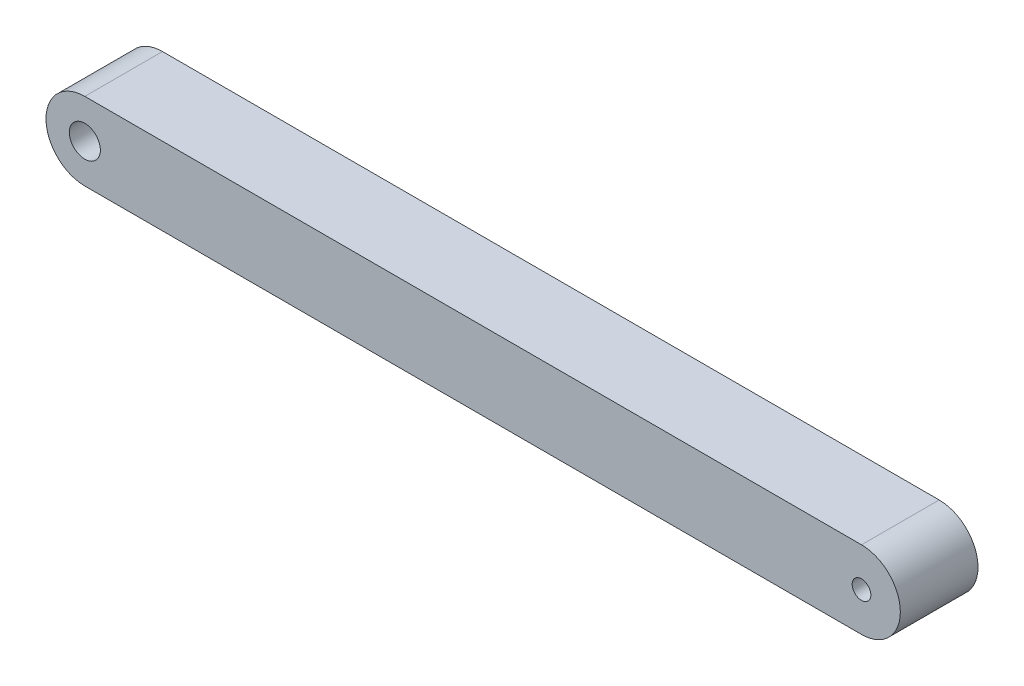
ISO-10303-21;
HEADER;
FILE_DESCRIPTION(('STEP AP214'),'2;1');
FILE_NAME('part.step','',(''),(''),'','','');
FILE_SCHEMA(('AUTOMOTIVE_DESIGN { 1 0 10303 214 1 1 1 1 }'));
ENDSEC;
DATA;
#1=APPLICATION_CONTEXT('core data for automotive mechanical design processes');
#2=APPLICATION_PROTOCOL_DEFINITION('international standard','automotive_design',2000,#1);
#3=PRODUCT_CONTEXT('',#1,'mechanical');
#4=PRODUCT('Part','Part','',(#3));
#5=PRODUCT_RELATED_PRODUCT_CATEGORY('part','',(#4));
#6=PRODUCT_DEFINITION_FORMATION('','',#4);
#7=PRODUCT_DEFINITION_CONTEXT('part definition',#1,'design');
#8=PRODUCT_DEFINITION('design','',#6,#7);
#9=PRODUCT_DEFINITION_SHAPE('','',#8);
#10=(LENGTH_UNIT() NAMED_UNIT(*) SI_UNIT(.MILLI.,.METRE.));
#11=(NAMED_UNIT(*) PLANE_ANGLE_UNIT() SI_UNIT($,.RADIAN.));
#12=(NAMED_UNIT(*) SI_UNIT($,.STERADIAN.) SOLID_ANGLE_UNIT());
#13=UNCERTAINTY_MEASURE_WITH_UNIT(LENGTH_MEASURE(1.E-05),#10,'distance_accuracy_value','');
#14=(GEOMETRIC_REPRESENTATION_CONTEXT(3) GLOBAL_UNCERTAINTY_ASSIGNED_CONTEXT((#13)) GLOBAL_UNIT_ASSIGNED_CONTEXT((#10,
#11,#12)) REPRESENTATION_CONTEXT('',''));
#15=CARTESIAN_POINT('',(0.,0.,0.));
#16=DIRECTION('',(0.,0.,1.));
#17=DIRECTION('',(1.,0.,0.));
#18=AXIS2_PLACEMENT_3D('',#15,#16,#17);
#19=CARTESIAN_POINT('',(-77.3942171788576,0.,10.));
#20=DIRECTION('',(0.,0.,-1.));
#21=DIRECTION('',(-1.,0.,0.));
#22=AXIS2_PLACEMENT_3D('',#19,#20,#21);
#23=CYLINDRICAL_SURFACE('',#22,5.);
#24=CARTESIAN_POINT('',(-77.3942171788576,0.,0.));
#25=DIRECTION('',(0.,0.,1.));
#26=DIRECTION('',(1.,0.,0.));
#27=AXIS2_PLACEMENT_3D('',#24,#25,#26);
#28=CIRCLE('',#27,5.);
#29=CARTESIAN_POINT('',(-77.3942171788576,5.,0.));
#30=VERTEX_POINT('',#29);
#31=CARTESIAN_POINT('',(-77.3942171788576,-5.,0.));
#32=VERTEX_POINT('',#31);
#33=EDGE_CURVE('E107',#30,#32,#28,.T.);
#34=ORIENTED_EDGE('',*,*,#33,.T.);
#35=DIRECTION('',(0.,0.,-1.));
#36=VECTOR('',#35,1.);
#37=CARTESIAN_POINT('',(-77.3942171788576,-5.,10.));
#38=LINE('',#37,#36);
#39=CARTESIAN_POINT('',(-77.3942171788576,-5.,10.));
#40=VERTEX_POINT('',#39);
#41=EDGE_CURVE('E11',#40,#32,#38,.T.);
#42=ORIENTED_EDGE('',*,*,#41,.F.);
#43=CARTESIAN_POINT('',(-77.3942171788576,0.,10.));
#44=DIRECTION('',(0.,0.,1.));
#45=DIRECTION('',(1.,0.,0.));
#46=AXIS2_PLACEMENT_3D('',#43,#44,#45);
#47=CIRCLE('',#46,5.);
#48=CARTESIAN_POINT('',(-77.3942171788576,5.,10.));
#49=VERTEX_POINT('',#48);
#50=EDGE_CURVE('E91',#49,#40,#47,.T.);
#51=ORIENTED_EDGE('',*,*,#50,.F.);
#52=DIRECTION('',(0.,0.,-1.));
#53=VECTOR('',#52,1.);
#54=CARTESIAN_POINT('',(-77.3942171788576,5.,10.));
#55=LINE('',#54,#53);
#56=EDGE_CURVE('E103',#49,#30,#55,.T.);
#57=ORIENTED_EDGE('',*,*,#56,.T.);
#58=EDGE_LOOP('',(#34,#42,#51,#57));
#59=FACE_BOUND('',#58,.T.);
#60=ADVANCED_FACE('F39',(#59),#23,.T.);
#61=CARTESIAN_POINT('',(-77.3942171788576,-5.,10.));
#62=DIRECTION('',(0.,1.,0.));
#63=DIRECTION('',(0.,0.,1.));
#64=AXIS2_PLACEMENT_3D('',#61,#62,#63);
#65=PLANE('',#64);
#66=DIRECTION('',(1.,0.,0.));
#67=VECTOR('',#66,1.);
#68=CARTESIAN_POINT('',(-77.3942171788576,-5.,0.));
#69=LINE('',#68,#67);
#70=CARTESIAN_POINT('',(22.6057828211424,-5.,0.));
#71=VERTEX_POINT('',#70);
#72=EDGE_CURVE('E96',#32,#71,#69,.T.);
#73=ORIENTED_EDGE('',*,*,#72,.T.);
#74=DIRECTION('',(0.,0.,-1.));
#75=VECTOR('',#74,1.);
#76=CARTESIAN_POINT('',(22.6057828211424,-5.,10.));
#77=LINE('',#76,#75);
#78=CARTESIAN_POINT('',(22.6057828211424,-5.,10.));
#79=VERTEX_POINT('',#78);
#80=EDGE_CURVE('E48',#79,#71,#77,.T.);
#81=ORIENTED_EDGE('',*,*,#80,.F.);
#82=DIRECTION('',(1.,0.,0.));
#83=VECTOR('',#82,1.);
#84=CARTESIAN_POINT('',(-77.3942171788576,-5.,10.));
#85=LINE('',#84,#83);
#86=EDGE_CURVE('E86',#40,#79,#85,.T.);
#87=ORIENTED_EDGE('',*,*,#86,.F.);
#88=ORIENTED_EDGE('',*,*,#41,.T.);
#89=EDGE_LOOP('',(#73,#81,#87,#88));
#90=FACE_BOUND('',#89,.T.);
#91=ADVANCED_FACE('F95',(#90),#65,.F.);
#92=CARTESIAN_POINT('',(22.6057828211424,0.,10.));
#93=DIRECTION('',(0.,0.,-1.));
#94=DIRECTION('',(-1.,0.,0.));
#95=AXIS2_PLACEMENT_3D('',#92,#93,#94);
#96=CYLINDRICAL_SURFACE('',#95,5.);
#97=CARTESIAN_POINT('',(22.6057828211424,0.,0.));
#98=DIRECTION('',(0.,0.,1.));
#99=DIRECTION('',(1.,0.,0.));
#100=AXIS2_PLACEMENT_3D('',#97,#98,#99);
#101=CIRCLE('',#100,5.);
#102=CARTESIAN_POINT('',(22.6057828211424,5.,0.));
#103=VERTEX_POINT('',#102);
#104=EDGE_CURVE('E73',#71,#103,#101,.T.);
#105=ORIENTED_EDGE('',*,*,#104,.T.);
#106=DIRECTION('',(0.,0.,-1.));
#107=VECTOR('',#106,1.);
#108=CARTESIAN_POINT('',(22.6057828211424,5.,10.));
#109=LINE('',#108,#107);
#110=CARTESIAN_POINT('',(22.6057828211424,5.,10.));
#111=VERTEX_POINT('',#110);
#112=EDGE_CURVE('E98',#111,#103,#109,.T.);
#113=ORIENTED_EDGE('',*,*,#112,.F.);
#114=CARTESIAN_POINT('',(22.6057828211424,0.,10.));
#115=DIRECTION('',(0.,0.,1.));
#116=DIRECTION('',(1.,0.,0.));
#117=AXIS2_PLACEMENT_3D('',#114,#115,#116);
#118=CIRCLE('',#117,5.);
#119=EDGE_CURVE('E89',#79,#111,#118,.T.);
#120=ORIENTED_EDGE('',*,*,#119,.F.);
#121=ORIENTED_EDGE('',*,*,#80,.T.);
#122=EDGE_LOOP('',(#105,#113,#120,#121));
#123=FACE_BOUND('',#122,.T.);
#124=ADVANCED_FACE('F99',(#123),#96,.T.);
#125=CARTESIAN_POINT('',(-77.3942171788576,5.,10.));
#126=DIRECTION('',(0.,-1.,0.));
#127=DIRECTION('',(0.,0.,-1.));
#128=AXIS2_PLACEMENT_3D('',#125,#126,#127);
#129=PLANE('',#128);
#130=DIRECTION('',(-1.,0.,0.));
#131=VECTOR('',#130,1.);
#132=CARTESIAN_POINT('',(-77.3942171788576,5.,0.));
#133=LINE('',#132,#131);
#134=EDGE_CURVE('E79',#103,#30,#133,.T.);
#135=ORIENTED_EDGE('',*,*,#134,.T.);
#136=ORIENTED_EDGE('',*,*,#56,.F.);
#137=DIRECTION('',(-1.,0.,0.));
#138=VECTOR('',#137,1.);
#139=CARTESIAN_POINT('',(-77.3942171788576,5.,10.));
#140=LINE('',#139,#138);
#141=EDGE_CURVE('E56',#111,#49,#140,.T.);
#142=ORIENTED_EDGE('',*,*,#141,.F.);
#143=ORIENTED_EDGE('',*,*,#112,.T.);
#144=EDGE_LOOP('',(#135,#136,#142,#143));
#145=FACE_BOUND('',#144,.T.);
#146=ADVANCED_FACE('F121',(#145),#129,.F.);
#147=CARTESIAN_POINT('',(-77.3942171788576,0.,10.));
#148=DIRECTION('',(0.,0.,1.));
#149=DIRECTION('',(1.,0.,0.));
#150=AXIS2_PLACEMENT_3D('',#147,#148,#149);
#151=PLANE('',#150);
#152=CARTESIAN_POINT('',(22.6057828211424,0.,10.));
#153=DIRECTION('',(0.,0.,1.));
#154=DIRECTION('',(1.,0.,0.));
#155=AXIS2_PLACEMENT_3D('',#152,#153,#154);
#156=CIRCLE('',#155,1.2);
#157=CARTESIAN_POINT('',(23.8057828211424,0.,10.));
#158=VERTEX_POINT('',#157);
#159=EDGE_CURVE('E136',#158,#158,#156,.T.);
#160=ORIENTED_EDGE('',*,*,#159,.F.);
#161=EDGE_LOOP('',(#160));
#162=FACE_BOUND('',#161,.T.);
#163=CARTESIAN_POINT('',(-77.3942171788576,0.,10.));
#164=DIRECTION('',(0.,0.,1.));
#165=DIRECTION('',(1.,0.,0.));
#166=AXIS2_PLACEMENT_3D('',#163,#164,#165);
#167=CIRCLE('',#166,2.);
#168=CARTESIAN_POINT('',(-75.3942171788576,0.,10.));
#169=VERTEX_POINT('',#168);
#170=EDGE_CURVE('E128',#169,#169,#167,.T.);
#171=ORIENTED_EDGE('',*,*,#170,.F.);
#172=EDGE_LOOP('',(#171));
#173=FACE_BOUND('',#172,.T.);
#174=ORIENTED_EDGE('',*,*,#50,.T.);
#175=ORIENTED_EDGE('',*,*,#86,.T.);
#176=ORIENTED_EDGE('',*,*,#119,.T.);
#177=ORIENTED_EDGE('',*,*,#141,.T.);
#178=EDGE_LOOP('',(#174,#175,#176,#177));
#179=FACE_BOUND('',#178,.T.);
#180=ADVANCED_FACE('F87',(#162,#173,#179),#151,.T.);
#181=CARTESIAN_POINT('',(-77.3942171788576,0.,0.));
#182=DIRECTION('',(0.,0.,1.));
#183=DIRECTION('',(1.,0.,0.));
#184=AXIS2_PLACEMENT_3D('',#181,#182,#183);
#185=PLANE('',#184);
#186=CARTESIAN_POINT('',(22.6057828211424,0.,0.));
#187=DIRECTION('',(0.,0.,1.));
#188=DIRECTION('',(1.,0.,0.));
#189=AXIS2_PLACEMENT_3D('',#186,#187,#188);
#190=CIRCLE('',#189,1.2);
#191=CARTESIAN_POINT('',(23.8057828211424,0.,0.));
#192=VERTEX_POINT('',#191);
#193=EDGE_CURVE('E132',#192,#192,#190,.T.);
#194=ORIENTED_EDGE('',*,*,#193,.T.);
#195=EDGE_LOOP('',(#194));
#196=FACE_BOUND('',#195,.T.);
#197=CARTESIAN_POINT('',(-77.3942171788576,0.,0.));
#198=DIRECTION('',(0.,0.,1.));
#199=DIRECTION('',(1.,0.,0.));
#200=AXIS2_PLACEMENT_3D('',#197,#198,#199);
#201=CIRCLE('',#200,2.);
#202=CARTESIAN_POINT('',(-75.3942171788576,0.,0.));
#203=VERTEX_POINT('',#202);
#204=EDGE_CURVE('E111',#203,#203,#201,.T.);
#205=ORIENTED_EDGE('',*,*,#204,.T.);
#206=EDGE_LOOP('',(#205));
#207=FACE_BOUND('',#206,.T.);
#208=ORIENTED_EDGE('',*,*,#33,.F.);
#209=ORIENTED_EDGE('',*,*,#134,.F.);
#210=ORIENTED_EDGE('',*,*,#104,.F.);
#211=ORIENTED_EDGE('',*,*,#72,.F.);
#212=EDGE_LOOP('',(#208,#209,#210,#211));
#213=FACE_BOUND('',#212,.T.);
#214=ADVANCED_FACE('F124',(#196,#207,#213),#185,.F.);
#215=CARTESIAN_POINT('',(-77.3942171788576,0.,0.));
#216=DIRECTION('',(0.,0.,1.));
#217=DIRECTION('',(1.,0.,0.));
#218=AXIS2_PLACEMENT_3D('',#215,#216,#217);
#219=CYLINDRICAL_SURFACE('',#218,2.);
#220=ORIENTED_EDGE('',*,*,#204,.F.);
#221=EDGE_LOOP('',(#220));
#222=FACE_BOUND('',#221,.T.);
#223=ORIENTED_EDGE('',*,*,#170,.T.);
#224=EDGE_LOOP('',(#223));
#225=FACE_BOUND('',#224,.T.);
#226=ADVANCED_FACE('F149',(#222,#225),#219,.F.);
#227=CARTESIAN_POINT('',(22.6057828211424,0.,0.));
#228=DIRECTION('',(0.,0.,1.));
#229=DIRECTION('',(1.,0.,0.));
#230=AXIS2_PLACEMENT_3D('',#227,#228,#229);
#231=CYLINDRICAL_SURFACE('',#230,1.2);
#232=ORIENTED_EDGE('',*,*,#193,.F.);
#233=EDGE_LOOP('',(#232));
#234=FACE_BOUND('',#233,.T.);
#235=ORIENTED_EDGE('',*,*,#159,.T.);
#236=EDGE_LOOP('',(#235));
#237=FACE_BOUND('',#236,.T.);
#238=ADVANCED_FACE('F146',(#234,#237),#231,.F.);
#239=CLOSED_SHELL('',(#60,#91,#124,#146,#180,#214,#226,#238));
#240=MANIFOLD_SOLID_BREP('B2',#239);
#241=ADVANCED_BREP_SHAPE_REPRESENTATION('',(#18,#240),#14);
#242=SHAPE_DEFINITION_REPRESENTATION(#9,#241);
ENDSEC;
END-ISO-10303-21;
